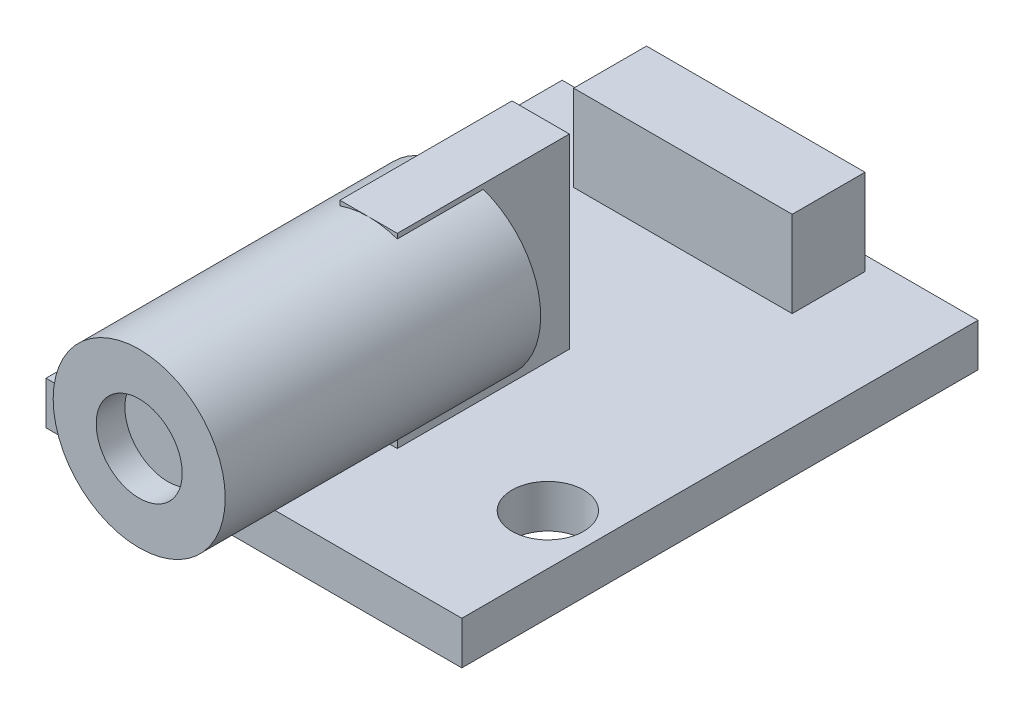
ISO-10303-21;
HEADER;
FILE_DESCRIPTION(('STEP AP214'),'2;1');
FILE_NAME('part.step','',(''),(''),'','','');
FILE_SCHEMA(('AUTOMOTIVE_DESIGN { 1 0 10303 214 1 1 1 1 }'));
ENDSEC;
DATA;
#1=APPLICATION_CONTEXT('core data for automotive mechanical design processes');
#2=APPLICATION_PROTOCOL_DEFINITION('international standard','automotive_design',2000,#1);
#3=PRODUCT_CONTEXT('',#1,'mechanical');
#4=PRODUCT('Part','Part','',(#3));
#5=PRODUCT_RELATED_PRODUCT_CATEGORY('part','',(#4));
#6=PRODUCT_DEFINITION_FORMATION('','',#4);
#7=PRODUCT_DEFINITION_CONTEXT('part definition',#1,'design');
#8=PRODUCT_DEFINITION('design','',#6,#7);
#9=PRODUCT_DEFINITION_SHAPE('','',#8);
#10=(LENGTH_UNIT() NAMED_UNIT(*) SI_UNIT(.MILLI.,.METRE.));
#11=(NAMED_UNIT(*) PLANE_ANGLE_UNIT() SI_UNIT($,.RADIAN.));
#12=(NAMED_UNIT(*) SI_UNIT($,.STERADIAN.) SOLID_ANGLE_UNIT());
#13=UNCERTAINTY_MEASURE_WITH_UNIT(LENGTH_MEASURE(1.E-05),#10,'distance_accuracy_value','');
#14=(GEOMETRIC_REPRESENTATION_CONTEXT(3) GLOBAL_UNCERTAINTY_ASSIGNED_CONTEXT((#13)) GLOBAL_UNIT_ASSIGNED_CONTEXT((#10,
#11,#12)) REPRESENTATION_CONTEXT('',''));
#15=CARTESIAN_POINT('',(0.,0.,0.));
#16=DIRECTION('',(0.,0.,1.));
#17=DIRECTION('',(1.,0.,0.));
#18=AXIS2_PLACEMENT_3D('',#15,#16,#17);
#19=CARTESIAN_POINT('',(0.,1.5,0.));
#20=DIRECTION('',(0.,1.,0.));
#21=DIRECTION('',(0.,0.,1.));
#22=AXIS2_PLACEMENT_3D('',#19,#20,#21);
#23=PLANE('',#22);
#24=CARTESIAN_POINT('',(-5.5,1.5,4.25));
#25=DIRECTION('',(0.,1.,0.));
#26=DIRECTION('',(0.,0.,1.));
#27=AXIS2_PLACEMENT_3D('',#24,#25,#26);
#28=CIRCLE('',#27,1.25);
#29=CARTESIAN_POINT('',(-5.5,1.5,5.5));
#30=VERTEX_POINT('',#29);
#31=EDGE_CURVE('E580',#30,#30,#28,.T.);
#32=ORIENTED_EDGE('',*,*,#31,.F.);
#33=EDGE_LOOP('',(#32));
#34=FACE_BOUND('',#33,.T.);
#35=CARTESIAN_POINT('',(5.5,1.5,4.25));
#36=DIRECTION('',(0.,1.,0.));
#37=DIRECTION('',(0.,0.,-1.));
#38=AXIS2_PLACEMENT_3D('',#35,#36,#37);
#39=CIRCLE('',#38,1.25);
#40=CARTESIAN_POINT('',(5.5,1.5,3.));
#41=VERTEX_POINT('',#40);
#42=EDGE_CURVE('E574',#41,#41,#39,.T.);
#43=ORIENTED_EDGE('',*,*,#42,.F.);
#44=EDGE_LOOP('',(#43));
#45=FACE_BOUND('',#44,.T.);
#46=DIRECTION('',(0.,0.,-1.));
#47=VECTOR('',#46,1.);
#48=CARTESIAN_POINT('',(7.25,1.5,-9.));
#49=LINE('',#48,#47);
#50=CARTESIAN_POINT('',(7.25,1.5,9.));
#51=VERTEX_POINT('',#50);
#52=CARTESIAN_POINT('',(7.25,1.5,-9.));
#53=VERTEX_POINT('',#52);
#54=EDGE_CURVE('E251',#51,#53,#49,.T.);
#55=ORIENTED_EDGE('',*,*,#54,.T.);
#56=DIRECTION('',(-1.,0.,0.));
#57=VECTOR('',#56,1.);
#58=CARTESIAN_POINT('',(-7.25,1.5,-9.));
#59=LINE('',#58,#57);
#60=CARTESIAN_POINT('',(-7.25,1.5,-9.));
#61=VERTEX_POINT('',#60);
#62=EDGE_CURVE('E254',#53,#61,#59,.T.);
#63=ORIENTED_EDGE('',*,*,#62,.T.);
#64=DIRECTION('',(0.,0.,1.));
#65=VECTOR('',#64,1.);
#66=CARTESIAN_POINT('',(-7.25,1.5,-9.));
#67=LINE('',#66,#65);
#68=CARTESIAN_POINT('',(-7.25,1.5,9.));
#69=VERTEX_POINT('',#68);
#70=EDGE_CURVE('E257',#61,#69,#67,.T.);
#71=ORIENTED_EDGE('',*,*,#70,.T.);
#72=DIRECTION('',(1.,0.,0.));
#73=VECTOR('',#72,1.);
#74=CARTESIAN_POINT('',(-7.25,1.5,9.));
#75=LINE('',#74,#73);
#76=EDGE_CURVE('E259',#69,#51,#75,.T.);
#77=ORIENTED_EDGE('',*,*,#76,.T.);
#78=EDGE_LOOP('',(#55,#63,#71,#77));
#79=FACE_BOUND('',#78,.T.);
#80=DIRECTION('',(-1.,0.,0.));
#81=VECTOR('',#80,1.);
#82=CARTESIAN_POINT('',(-1.,1.5,-1.));
#83=LINE('',#82,#81);
#84=CARTESIAN_POINT('',(1.,1.5,-1.));
#85=VERTEX_POINT('',#84);
#86=CARTESIAN_POINT('',(-1.,1.5,-1.));
#87=VERTEX_POINT('',#86);
#88=EDGE_CURVE('E231',#85,#87,#83,.T.);
#89=ORIENTED_EDGE('',*,*,#88,.F.);
#90=DIRECTION('',(0.,0.,-1.));
#91=VECTOR('',#90,1.);
#92=CARTESIAN_POINT('',(1.,1.5,-1.));
#93=LINE('',#92,#91);
#94=CARTESIAN_POINT('',(1.,1.5,5.));
#95=VERTEX_POINT('',#94);
#96=EDGE_CURVE('E215',#95,#85,#93,.T.);
#97=ORIENTED_EDGE('',*,*,#96,.F.);
#98=DIRECTION('',(1.,0.,0.));
#99=VECTOR('',#98,1.);
#100=CARTESIAN_POINT('',(-1.,1.5,5.));
#101=LINE('',#100,#99);
#102=CARTESIAN_POINT('',(-1.,1.5,5.));
#103=VERTEX_POINT('',#102);
#104=EDGE_CURVE('E220',#103,#95,#101,.T.);
#105=ORIENTED_EDGE('',*,*,#104,.F.);
#106=DIRECTION('',(0.,0.,1.));
#107=VECTOR('',#106,1.);
#108=CARTESIAN_POINT('',(-1.,1.5,-1.));
#109=LINE('',#108,#107);
#110=EDGE_CURVE('E233',#87,#103,#109,.T.);
#111=ORIENTED_EDGE('',*,*,#110,.F.);
#112=EDGE_LOOP('',(#89,#97,#105,#111));
#113=FACE_BOUND('',#112,.T.);
#114=DIRECTION('',(-1.,0.,0.));
#115=VECTOR('',#114,1.);
#116=CARTESIAN_POINT('',(-3.81,1.5,-8.5));
#117=LINE('',#116,#115);
#118=CARTESIAN_POINT('',(3.81,1.5,-8.5));
#119=VERTEX_POINT('',#118);
#120=CARTESIAN_POINT('',(-3.81,1.5,-8.5));
#121=VERTEX_POINT('',#120);
#122=EDGE_CURVE('E561',#119,#121,#117,.T.);
#123=ORIENTED_EDGE('',*,*,#122,.F.);
#124=DIRECTION('',(0.,0.,-1.));
#125=VECTOR('',#124,1.);
#126=CARTESIAN_POINT('',(3.81,1.5,-8.5));
#127=LINE('',#126,#125);
#128=CARTESIAN_POINT('',(3.81,1.5,-5.96));
#129=VERTEX_POINT('',#128);
#130=EDGE_CURVE('E177',#129,#119,#127,.T.);
#131=ORIENTED_EDGE('',*,*,#130,.F.);
#132=DIRECTION('',(1.,0.,0.));
#133=VECTOR('',#132,1.);
#134=CARTESIAN_POINT('',(-3.81,1.5,-5.96));
#135=LINE('',#134,#133);
#136=CARTESIAN_POINT('',(-3.81,1.5,-5.96));
#137=VERTEX_POINT('',#136);
#138=EDGE_CURVE('E173',#137,#129,#135,.T.);
#139=ORIENTED_EDGE('',*,*,#138,.F.);
#140=DIRECTION('',(0.,0.,1.));
#141=VECTOR('',#140,1.);
#142=CARTESIAN_POINT('',(-3.81,1.5,-8.5));
#143=LINE('',#142,#141);
#144=EDGE_CURVE('E563',#121,#137,#143,.T.);
#145=ORIENTED_EDGE('',*,*,#144,.F.);
#146=EDGE_LOOP('',(#123,#131,#139,#145));
#147=FACE_BOUND('',#146,.T.);
#148=ADVANCED_FACE('F37',(#34,#45,#79,#113,#147),#23,.T.);
#149=CARTESIAN_POINT('',(-1.,8.,5.));
#150=DIRECTION('',(0.,0.,-1.));
#151=DIRECTION('',(-1.,0.,0.));
#152=AXIS2_PLACEMENT_3D('',#149,#150,#151);
#153=PLANE('',#152);
#154=DIRECTION('',(0.,-1.,0.));
#155=VECTOR('',#154,1.);
#156=CARTESIAN_POINT('',(-1.,8.,5.));
#157=LINE('',#156,#155);
#158=CARTESIAN_POINT('',(-1.,8.,5.));
#159=VERTEX_POINT('',#158);
#160=CARTESIAN_POINT('',(-1.,7.82842712474619,5.));
#161=VERTEX_POINT('',#160);
#162=EDGE_CURVE('E242',#159,#161,#157,.T.);
#163=ORIENTED_EDGE('',*,*,#162,.T.);
#164=CARTESIAN_POINT('',(0.,5.,5.));
#165=DIRECTION('',(0.,0.,-1.));
#166=DIRECTION('',(-1.,0.,0.));
#167=AXIS2_PLACEMENT_3D('',#164,#165,#166);
#168=CIRCLE('',#167,3.);
#169=CARTESIAN_POINT('',(0.,8.,5.));
#170=VERTEX_POINT('',#169);
#171=EDGE_CURVE('E204',#161,#170,#168,.T.);
#172=ORIENTED_EDGE('',*,*,#171,.T.);
#173=DIRECTION('',(1.,0.,0.));
#174=VECTOR('',#173,1.);
#175=CARTESIAN_POINT('',(-1.,8.,5.));
#176=LINE('',#175,#174);
#177=EDGE_CURVE('E225',#159,#170,#176,.T.);
#178=ORIENTED_EDGE('',*,*,#177,.F.);
#179=EDGE_LOOP('',(#163,#172,#178));
#180=FACE_BOUND('',#179,.T.);
#181=ADVANCED_FACE('F303',(#180),#153,.F.);
#182=CARTESIAN_POINT('',(1.,8.,5.));
#183=VERTEX_POINT('',#182);
#184=EDGE_CURVE('E224',#170,#183,#176,.T.);
#185=ORIENTED_EDGE('',*,*,#184,.F.);
#186=CARTESIAN_POINT('',(1.,7.82842712474619,5.));
#187=VERTEX_POINT('',#186);
#188=EDGE_CURVE('E200',#170,#187,#168,.T.);
#189=ORIENTED_EDGE('',*,*,#188,.T.);
#190=DIRECTION('',(0.,-1.,0.));
#191=VECTOR('',#190,1.);
#192=CARTESIAN_POINT('',(1.,8.,5.));
#193=LINE('',#192,#191);
#194=EDGE_CURVE('E238',#183,#187,#193,.T.);
#195=ORIENTED_EDGE('',*,*,#194,.F.);
#196=EDGE_LOOP('',(#185,#189,#195));
#197=FACE_BOUND('',#196,.T.);
#198=ADVANCED_FACE('F301',(#197),#153,.F.);
#199=CARTESIAN_POINT('',(7.25,1.5,-9.));
#200=DIRECTION('',(-1.,0.,0.));
#201=DIRECTION('',(0.,0.,1.));
#202=AXIS2_PLACEMENT_3D('',#199,#200,#201);
#203=PLANE('',#202);
#204=DIRECTION('',(0.,0.,-1.));
#205=VECTOR('',#204,1.);
#206=CARTESIAN_POINT('',(7.25,0.,-9.));
#207=LINE('',#206,#205);
#208=CARTESIAN_POINT('',(7.25,0.,9.));
#209=VERTEX_POINT('',#208);
#210=CARTESIAN_POINT('',(7.25,0.,-9.));
#211=VERTEX_POINT('',#210);
#212=EDGE_CURVE('E250',#209,#211,#207,.T.);
#213=ORIENTED_EDGE('',*,*,#212,.T.);
#214=DIRECTION('',(0.,-1.,0.));
#215=VECTOR('',#214,1.);
#216=CARTESIAN_POINT('',(7.25,1.5,-9.));
#217=LINE('',#216,#215);
#218=EDGE_CURVE('E11',#53,#211,#217,.T.);
#219=ORIENTED_EDGE('',*,*,#218,.F.);
#220=ORIENTED_EDGE('',*,*,#54,.F.);
#221=DIRECTION('',(0.,-1.,0.));
#222=VECTOR('',#221,1.);
#223=CARTESIAN_POINT('',(7.25,1.5,9.));
#224=LINE('',#223,#222);
#225=EDGE_CURVE('E261',#51,#209,#224,.T.);
#226=ORIENTED_EDGE('',*,*,#225,.T.);
#227=EDGE_LOOP('',(#213,#219,#220,#226));
#228=FACE_BOUND('',#227,.T.);
#229=ADVANCED_FACE('F39',(#228),#203,.F.);
#230=CARTESIAN_POINT('',(-7.25,1.5,-9.));
#231=DIRECTION('',(0.,0.,1.));
#232=DIRECTION('',(1.,0.,0.));
#233=AXIS2_PLACEMENT_3D('',#230,#231,#232);
#234=PLANE('',#233);
#235=DIRECTION('',(-1.,0.,0.));
#236=VECTOR('',#235,1.);
#237=CARTESIAN_POINT('',(-7.25,0.,-9.));
#238=LINE('',#237,#236);
#239=CARTESIAN_POINT('',(-7.25,0.,-9.));
#240=VERTEX_POINT('',#239);
#241=EDGE_CURVE('E264',#211,#240,#238,.T.);
#242=ORIENTED_EDGE('',*,*,#241,.T.);
#243=DIRECTION('',(0.,-1.,0.));
#244=VECTOR('',#243,1.);
#245=CARTESIAN_POINT('',(-7.25,1.5,-9.));
#246=LINE('',#245,#244);
#247=EDGE_CURVE('E45',#61,#240,#246,.T.);
#248=ORIENTED_EDGE('',*,*,#247,.F.);
#249=ORIENTED_EDGE('',*,*,#62,.F.);
#250=ORIENTED_EDGE('',*,*,#218,.T.);
#251=EDGE_LOOP('',(#242,#248,#249,#250));
#252=FACE_BOUND('',#251,.T.);
#253=ADVANCED_FACE('F294',(#252),#234,.F.);
#254=CARTESIAN_POINT('',(-7.25,1.5,-9.));
#255=DIRECTION('',(1.,0.,0.));
#256=DIRECTION('',(0.,0.,-1.));
#257=AXIS2_PLACEMENT_3D('',#254,#255,#256);
#258=PLANE('',#257);
#259=DIRECTION('',(0.,0.,1.));
#260=VECTOR('',#259,1.);
#261=CARTESIAN_POINT('',(-7.25,0.,-9.));
#262=LINE('',#261,#260);
#263=CARTESIAN_POINT('',(-7.25,0.,9.));
#264=VERTEX_POINT('',#263);
#265=EDGE_CURVE('E266',#240,#264,#262,.T.);
#266=ORIENTED_EDGE('',*,*,#265,.T.);
#267=DIRECTION('',(0.,-1.,0.));
#268=VECTOR('',#267,1.);
#269=CARTESIAN_POINT('',(-7.25,1.5,9.));
#270=LINE('',#269,#268);
#271=EDGE_CURVE('E271',#69,#264,#270,.T.);
#272=ORIENTED_EDGE('',*,*,#271,.F.);
#273=ORIENTED_EDGE('',*,*,#70,.F.);
#274=ORIENTED_EDGE('',*,*,#247,.T.);
#275=EDGE_LOOP('',(#266,#272,#273,#274));
#276=FACE_BOUND('',#275,.T.);
#277=ADVANCED_FACE('F278',(#276),#258,.F.);
#278=CARTESIAN_POINT('',(-7.25,1.5,9.));
#279=DIRECTION('',(0.,0.,-1.));
#280=DIRECTION('',(-1.,0.,0.));
#281=AXIS2_PLACEMENT_3D('',#278,#279,#280);
#282=PLANE('',#281);
#283=DIRECTION('',(1.,0.,0.));
#284=VECTOR('',#283,1.);
#285=CARTESIAN_POINT('',(-7.25,0.,9.));
#286=LINE('',#285,#284);
#287=EDGE_CURVE('E255',#264,#209,#286,.T.);
#288=ORIENTED_EDGE('',*,*,#287,.T.);
#289=ORIENTED_EDGE('',*,*,#225,.F.);
#290=ORIENTED_EDGE('',*,*,#76,.F.);
#291=ORIENTED_EDGE('',*,*,#271,.T.);
#292=EDGE_LOOP('',(#288,#289,#290,#291));
#293=FACE_BOUND('',#292,.T.);
#294=ADVANCED_FACE('F287',(#293),#282,.F.);
#295=CARTESIAN_POINT('',(0.,0.,0.));
#296=DIRECTION('',(0.,1.,0.));
#297=DIRECTION('',(0.,0.,1.));
#298=AXIS2_PLACEMENT_3D('',#295,#296,#297);
#299=PLANE('',#298);
#300=CARTESIAN_POINT('',(-5.5,0.,4.25));
#301=DIRECTION('',(0.,1.,0.));
#302=DIRECTION('',(0.,0.,1.));
#303=AXIS2_PLACEMENT_3D('',#300,#301,#302);
#304=CIRCLE('',#303,1.25);
#305=CARTESIAN_POINT('',(-5.5,0.,5.5));
#306=VERTEX_POINT('',#305);
#307=EDGE_CURVE('E566',#306,#306,#304,.T.);
#308=ORIENTED_EDGE('',*,*,#307,.T.);
#309=EDGE_LOOP('',(#308));
#310=FACE_BOUND('',#309,.T.);
#311=CARTESIAN_POINT('',(5.5,0.,4.25));
#312=DIRECTION('',(0.,1.,0.));
#313=DIRECTION('',(0.,0.,-1.));
#314=AXIS2_PLACEMENT_3D('',#311,#312,#313);
#315=CIRCLE('',#314,1.25);
#316=CARTESIAN_POINT('',(5.5,0.,3.));
#317=VERTEX_POINT('',#316);
#318=EDGE_CURVE('E577',#317,#317,#315,.T.);
#319=ORIENTED_EDGE('',*,*,#318,.T.);
#320=EDGE_LOOP('',(#319));
#321=FACE_BOUND('',#320,.T.);
#322=ORIENTED_EDGE('',*,*,#212,.F.);
#323=ORIENTED_EDGE('',*,*,#287,.F.);
#324=ORIENTED_EDGE('',*,*,#265,.F.);
#325=ORIENTED_EDGE('',*,*,#241,.F.);
#326=EDGE_LOOP('',(#322,#323,#324,#325));
#327=FACE_BOUND('',#326,.T.);
#328=ADVANCED_FACE('F284',(#310,#321,#327),#299,.F.);
#329=CARTESIAN_POINT('',(1.,8.,-1.));
#330=DIRECTION('',(-1.,0.,0.));
#331=DIRECTION('',(0.,0.,1.));
#332=AXIS2_PLACEMENT_3D('',#329,#330,#331);
#333=PLANE('',#332);
#334=DIRECTION('',(0.,1.,0.));
#335=VECTOR('',#334,1.);
#336=CARTESIAN_POINT('',(1.,8.,2.));
#337=LINE('',#336,#335);
#338=CARTESIAN_POINT('',(1.,2.17157287525381,2.));
#339=VERTEX_POINT('',#338);
#340=CARTESIAN_POINT('',(1.,7.82842712474619,2.));
#341=VERTEX_POINT('',#340);
#342=EDGE_CURVE('E198',#339,#341,#337,.T.);
#343=ORIENTED_EDGE('',*,*,#342,.F.);
#344=DIRECTION('',(0.,0.,1.));
#345=VECTOR('',#344,1.);
#346=CARTESIAN_POINT('',(1.,2.17157287525381,2.));
#347=LINE('',#346,#345);
#348=CARTESIAN_POINT('',(1.,2.17157287525381,5.));
#349=VERTEX_POINT('',#348);
#350=EDGE_CURVE('E209',#339,#349,#347,.T.);
#351=ORIENTED_EDGE('',*,*,#350,.T.);
#352=EDGE_CURVE('E228',#349,#95,#193,.T.);
#353=ORIENTED_EDGE('',*,*,#352,.T.);
#354=ORIENTED_EDGE('',*,*,#96,.T.);
#355=DIRECTION('',(0.,-1.,0.));
#356=VECTOR('',#355,1.);
#357=CARTESIAN_POINT('',(1.,8.,-1.));
#358=LINE('',#357,#356);
#359=CARTESIAN_POINT('',(1.,8.,-1.));
#360=VERTEX_POINT('',#359);
#361=EDGE_CURVE('E248',#360,#85,#358,.T.);
#362=ORIENTED_EDGE('',*,*,#361,.F.);
#363=DIRECTION('',(0.,0.,-1.));
#364=VECTOR('',#363,1.);
#365=CARTESIAN_POINT('',(1.,8.,-1.));
#366=LINE('',#365,#364);
#367=EDGE_CURVE('E216',#183,#360,#366,.T.);
#368=ORIENTED_EDGE('',*,*,#367,.F.);
#369=ORIENTED_EDGE('',*,*,#194,.T.);
#370=DIRECTION('',(0.,0.,1.));
#371=VECTOR('',#370,1.);
#372=CARTESIAN_POINT('',(1.,7.82842712474619,2.));
#373=LINE('',#372,#371);
#374=EDGE_CURVE('E203',#187,#341,#373,.F.);
#375=ORIENTED_EDGE('',*,*,#374,.T.);
#376=EDGE_LOOP('',(#343,#351,#353,#354,#362,#368,#369,#375));
#377=FACE_BOUND('',#376,.T.);
#378=ADVANCED_FACE('F316',(#377),#333,.F.);
#379=CARTESIAN_POINT('',(-1.,8.,-1.));
#380=DIRECTION('',(0.,0.,1.));
#381=DIRECTION('',(1.,0.,0.));
#382=AXIS2_PLACEMENT_3D('',#379,#380,#381);
#383=PLANE('',#382);
#384=ORIENTED_EDGE('',*,*,#88,.T.);
#385=DIRECTION('',(0.,-1.,0.));
#386=VECTOR('',#385,1.);
#387=CARTESIAN_POINT('',(-1.,8.,-1.));
#388=LINE('',#387,#386);
#389=CARTESIAN_POINT('',(-1.,8.,-1.));
#390=VERTEX_POINT('',#389);
#391=EDGE_CURVE('E245',#390,#87,#388,.T.);
#392=ORIENTED_EDGE('',*,*,#391,.F.);
#393=DIRECTION('',(-1.,0.,0.));
#394=VECTOR('',#393,1.);
#395=CARTESIAN_POINT('',(-1.,8.,-1.));
#396=LINE('',#395,#394);
#397=EDGE_CURVE('E219',#360,#390,#396,.T.);
#398=ORIENTED_EDGE('',*,*,#397,.F.);
#399=ORIENTED_EDGE('',*,*,#361,.T.);
#400=EDGE_LOOP('',(#384,#392,#398,#399));
#401=FACE_BOUND('',#400,.T.);
#402=ADVANCED_FACE('F338',(#401),#383,.F.);
#403=CARTESIAN_POINT('',(-1.,8.,-1.));
#404=DIRECTION('',(1.,0.,0.));
#405=DIRECTION('',(0.,0.,-1.));
#406=AXIS2_PLACEMENT_3D('',#403,#404,#405);
#407=PLANE('',#406);
#408=DIRECTION('',(0.,-1.,0.));
#409=VECTOR('',#408,1.);
#410=CARTESIAN_POINT('',(-1.,8.,2.));
#411=LINE('',#410,#409);
#412=CARTESIAN_POINT('',(-1.,7.82842712474619,2.));
#413=VERTEX_POINT('',#412);
#414=CARTESIAN_POINT('',(-1.,2.17157287525381,2.));
#415=VERTEX_POINT('',#414);
#416=EDGE_CURVE('E196',#413,#415,#411,.T.);
#417=ORIENTED_EDGE('',*,*,#416,.F.);
#418=DIRECTION('',(0.,0.,1.));
#419=VECTOR('',#418,1.);
#420=CARTESIAN_POINT('',(-1.,7.82842712474619,2.));
#421=LINE('',#420,#419);
#422=EDGE_CURVE('E212',#413,#161,#421,.T.);
#423=ORIENTED_EDGE('',*,*,#422,.T.);
#424=ORIENTED_EDGE('',*,*,#162,.F.);
#425=DIRECTION('',(0.,0.,1.));
#426=VECTOR('',#425,1.);
#427=CARTESIAN_POINT('',(-1.,8.,-1.));
#428=LINE('',#427,#426);
#429=EDGE_CURVE('E222',#390,#159,#428,.T.);
#430=ORIENTED_EDGE('',*,*,#429,.F.);
#431=ORIENTED_EDGE('',*,*,#391,.T.);
#432=ORIENTED_EDGE('',*,*,#110,.T.);
#433=CARTESIAN_POINT('',(-1.,2.17157287525381,5.));
#434=VERTEX_POINT('',#433);
#435=EDGE_CURVE('E241',#434,#103,#157,.T.);
#436=ORIENTED_EDGE('',*,*,#435,.F.);
#437=DIRECTION('',(0.,0.,1.));
#438=VECTOR('',#437,1.);
#439=CARTESIAN_POINT('',(-1.,2.17157287525381,2.));
#440=LINE('',#439,#438);
#441=EDGE_CURVE('E60',#434,#415,#440,.F.);
#442=ORIENTED_EDGE('',*,*,#441,.T.);
#443=EDGE_LOOP('',(#417,#423,#424,#430,#431,#432,#436,#442));
#444=FACE_BOUND('',#443,.T.);
#445=ADVANCED_FACE('F346',(#444),#407,.F.);
#446=ORIENTED_EDGE('',*,*,#352,.F.);
#447=EDGE_CURVE('E205',#349,#434,#168,.T.);
#448=ORIENTED_EDGE('',*,*,#447,.T.);
#449=ORIENTED_EDGE('',*,*,#435,.T.);
#450=ORIENTED_EDGE('',*,*,#104,.T.);
#451=EDGE_LOOP('',(#446,#448,#449,#450));
#452=FACE_BOUND('',#451,.T.);
#453=ADVANCED_FACE('F311',(#452),#153,.F.);
#454=CARTESIAN_POINT('',(0.,8.,0.));
#455=DIRECTION('',(0.,1.,0.));
#456=DIRECTION('',(0.,0.,1.));
#457=AXIS2_PLACEMENT_3D('',#454,#455,#456);
#458=PLANE('',#457);
#459=ORIENTED_EDGE('',*,*,#177,.T.);
#460=ORIENTED_EDGE('',*,*,#184,.T.);
#461=ORIENTED_EDGE('',*,*,#367,.T.);
#462=ORIENTED_EDGE('',*,*,#397,.T.);
#463=ORIENTED_EDGE('',*,*,#429,.T.);
#464=EDGE_LOOP('',(#459,#460,#461,#462,#463));
#465=FACE_BOUND('',#464,.T.);
#466=ADVANCED_FACE('F360',(#465),#458,.T.);
#467=CARTESIAN_POINT('',(0.,5.,2.));
#468=DIRECTION('',(0.,0.,1.));
#469=DIRECTION('',(1.,0.,0.));
#470=AXIS2_PLACEMENT_3D('',#467,#468,#469);
#471=CYLINDRICAL_SURFACE('',#470,3.);
#472=CARTESIAN_POINT('',(0.,5.,13.));
#473=DIRECTION('',(0.,0.,1.));
#474=DIRECTION('',(1.,0.,0.));
#475=AXIS2_PLACEMENT_3D('',#472,#473,#474);
#476=CIRCLE('',#475,3.);
#477=CARTESIAN_POINT('',(3.,5.,13.));
#478=VERTEX_POINT('',#477);
#479=EDGE_CURVE('E188',#478,#478,#476,.T.);
#480=ORIENTED_EDGE('',*,*,#479,.F.);
#481=EDGE_LOOP('',(#480));
#482=FACE_BOUND('',#481,.T.);
#483=ORIENTED_EDGE('',*,*,#422,.F.);
#484=CARTESIAN_POINT('',(0.,5.,2.));
#485=DIRECTION('',(0.,0.,1.));
#486=DIRECTION('',(1.,0.,0.));
#487=AXIS2_PLACEMENT_3D('',#484,#485,#486);
#488=CIRCLE('',#487,3.);
#489=EDGE_CURVE('E195',#413,#415,#488,.T.);
#490=ORIENTED_EDGE('',*,*,#489,.T.);
#491=ORIENTED_EDGE('',*,*,#441,.F.);
#492=ORIENTED_EDGE('',*,*,#447,.F.);
#493=ORIENTED_EDGE('',*,*,#350,.F.);
#494=EDGE_CURVE('E192',#339,#341,#488,.T.);
#495=ORIENTED_EDGE('',*,*,#494,.T.);
#496=ORIENTED_EDGE('',*,*,#374,.F.);
#497=ORIENTED_EDGE('',*,*,#188,.F.);
#498=ORIENTED_EDGE('',*,*,#171,.F.);
#499=EDGE_LOOP('',(#483,#490,#491,#492,#493,#495,#496,#497,#498));
#500=FACE_BOUND('',#499,.T.);
#501=ADVANCED_FACE('F367',(#482,#500),#471,.T.);
#502=CARTESIAN_POINT('',(0.,5.,2.));
#503=DIRECTION('',(0.,0.,1.));
#504=DIRECTION('',(1.,0.,0.));
#505=AXIS2_PLACEMENT_3D('',#502,#503,#504);
#506=PLANE('',#505);
#507=ORIENTED_EDGE('',*,*,#494,.F.);
#508=ORIENTED_EDGE('',*,*,#342,.T.);
#509=EDGE_LOOP('',(#507,#508));
#510=FACE_BOUND('',#509,.T.);
#511=ADVANCED_FACE('F375',(#510),#506,.F.);
#512=ORIENTED_EDGE('',*,*,#489,.F.);
#513=ORIENTED_EDGE('',*,*,#416,.T.);
#514=EDGE_LOOP('',(#512,#513));
#515=FACE_BOUND('',#514,.T.);
#516=ADVANCED_FACE('F383',(#515),#506,.F.);
#517=CARTESIAN_POINT('',(0.,5.,13.));
#518=DIRECTION('',(0.,0.,1.));
#519=DIRECTION('',(1.,0.,0.));
#520=AXIS2_PLACEMENT_3D('',#517,#518,#519);
#521=PLANE('',#520);
#522=CARTESIAN_POINT('',(0.,5.,13.));
#523=DIRECTION('',(0.,0.,1.));
#524=DIRECTION('',(1.,0.,0.));
#525=AXIS2_PLACEMENT_3D('',#522,#523,#524);
#526=CIRCLE('',#525,1.5);
#527=CARTESIAN_POINT('',(1.5,5.,13.));
#528=VERTEX_POINT('',#527);
#529=EDGE_CURVE('E179',#528,#528,#526,.T.);
#530=ORIENTED_EDGE('',*,*,#529,.F.);
#531=EDGE_LOOP('',(#530));
#532=FACE_BOUND('',#531,.T.);
#533=ORIENTED_EDGE('',*,*,#479,.T.);
#534=EDGE_LOOP('',(#533));
#535=FACE_BOUND('',#534,.T.);
#536=ADVANCED_FACE('F391',(#532,#535),#521,.T.);
#537=CARTESIAN_POINT('',(0.,5.,12.));
#538=DIRECTION('',(0.,0.,1.));
#539=DIRECTION('',(1.,0.,0.));
#540=AXIS2_PLACEMENT_3D('',#537,#538,#539);
#541=CYLINDRICAL_SURFACE('',#540,1.5);
#542=CARTESIAN_POINT('',(0.,5.,12.));
#543=DIRECTION('',(0.,0.,1.));
#544=DIRECTION('',(1.,0.,0.));
#545=AXIS2_PLACEMENT_3D('',#542,#543,#544);
#546=CIRCLE('',#545,1.5);
#547=CARTESIAN_POINT('',(1.5,5.,12.));
#548=VERTEX_POINT('',#547);
#549=EDGE_CURVE('E182',#548,#548,#546,.T.);
#550=ORIENTED_EDGE('',*,*,#549,.F.);
#551=EDGE_LOOP('',(#550));
#552=FACE_BOUND('',#551,.T.);
#553=ORIENTED_EDGE('',*,*,#529,.T.);
#554=EDGE_LOOP('',(#553));
#555=FACE_BOUND('',#554,.T.);
#556=ADVANCED_FACE('F398',(#552,#555),#541,.F.);
#557=CARTESIAN_POINT('',(0.,5.,12.));
#558=DIRECTION('',(0.,0.,1.));
#559=DIRECTION('',(1.,0.,0.));
#560=AXIS2_PLACEMENT_3D('',#557,#558,#559);
#561=PLANE('',#560);
#562=ORIENTED_EDGE('',*,*,#549,.T.);
#563=EDGE_LOOP('',(#562));
#564=FACE_BOUND('',#563,.T.);
#565=ADVANCED_FACE('F407',(#564),#561,.T.);
#566=CARTESIAN_POINT('',(3.81,4.5,-8.5));
#567=DIRECTION('',(-1.,0.,0.));
#568=DIRECTION('',(0.,0.,1.));
#569=AXIS2_PLACEMENT_3D('',#566,#567,#568);
#570=PLANE('',#569);
#571=ORIENTED_EDGE('',*,*,#130,.T.);
#572=DIRECTION('',(0.,-1.,0.));
#573=VECTOR('',#572,1.);
#574=CARTESIAN_POINT('',(3.81,4.5,-8.5));
#575=LINE('',#574,#573);
#576=CARTESIAN_POINT('',(3.81,4.5,-8.5));
#577=VERTEX_POINT('',#576);
#578=EDGE_CURVE('E158',#577,#119,#575,.T.);
#579=ORIENTED_EDGE('',*,*,#578,.F.);
#580=DIRECTION('',(0.,0.,-1.));
#581=VECTOR('',#580,1.);
#582=CARTESIAN_POINT('',(3.81,4.5,-8.5));
#583=LINE('',#582,#581);
#584=CARTESIAN_POINT('',(3.81,4.5,-5.96));
#585=VERTEX_POINT('',#584);
#586=EDGE_CURVE('E165',#585,#577,#583,.T.);
#587=ORIENTED_EDGE('',*,*,#586,.F.);
#588=DIRECTION('',(0.,-1.,0.));
#589=VECTOR('',#588,1.);
#590=CARTESIAN_POINT('',(3.81,4.5,-5.96));
#591=LINE('',#590,#589);
#592=EDGE_CURVE('E571',#585,#129,#591,.T.);
#593=ORIENTED_EDGE('',*,*,#592,.T.);
#594=EDGE_LOOP('',(#571,#579,#587,#593));
#595=FACE_BOUND('',#594,.T.);
#596=ADVANCED_FACE('F175',(#595),#570,.F.);
#597=CARTESIAN_POINT('',(-3.81,4.5,-8.5));
#598=DIRECTION('',(0.,0.,1.));
#599=DIRECTION('',(1.,0.,0.));
#600=AXIS2_PLACEMENT_3D('',#597,#598,#599);
#601=PLANE('',#600);
#602=ORIENTED_EDGE('',*,*,#122,.T.);
#603=DIRECTION('',(0.,-1.,0.));
#604=VECTOR('',#603,1.);
#605=CARTESIAN_POINT('',(-3.81,4.5,-8.5));
#606=LINE('',#605,#604);
#607=CARTESIAN_POINT('',(-3.81,4.5,-8.5));
#608=VERTEX_POINT('',#607);
#609=EDGE_CURVE('E161',#608,#121,#606,.T.);
#610=ORIENTED_EDGE('',*,*,#609,.F.);
#611=DIRECTION('',(-1.,0.,0.));
#612=VECTOR('',#611,1.);
#613=CARTESIAN_POINT('',(-3.81,4.5,-8.5));
#614=LINE('',#613,#612);
#615=EDGE_CURVE('E154',#577,#608,#614,.T.);
#616=ORIENTED_EDGE('',*,*,#615,.F.);
#617=ORIENTED_EDGE('',*,*,#578,.T.);
#618=EDGE_LOOP('',(#602,#610,#616,#617));
#619=FACE_BOUND('',#618,.T.);
#620=ADVANCED_FACE('F156',(#619),#601,.F.);
#621=CARTESIAN_POINT('',(-3.81,4.5,-8.5));
#622=DIRECTION('',(1.,0.,0.));
#623=DIRECTION('',(0.,0.,-1.));
#624=AXIS2_PLACEMENT_3D('',#621,#622,#623);
#625=PLANE('',#624);
#626=ORIENTED_EDGE('',*,*,#144,.T.);
#627=DIRECTION('',(0.,-1.,0.));
#628=VECTOR('',#627,1.);
#629=CARTESIAN_POINT('',(-3.81,4.5,-5.96));
#630=LINE('',#629,#628);
#631=CARTESIAN_POINT('',(-3.81,4.5,-5.96));
#632=VERTEX_POINT('',#631);
#633=EDGE_CURVE('E52',#632,#137,#630,.T.);
#634=ORIENTED_EDGE('',*,*,#633,.F.);
#635=DIRECTION('',(0.,0.,1.));
#636=VECTOR('',#635,1.);
#637=CARTESIAN_POINT('',(-3.81,4.5,-8.5));
#638=LINE('',#637,#636);
#639=EDGE_CURVE('E164',#608,#632,#638,.T.);
#640=ORIENTED_EDGE('',*,*,#639,.F.);
#641=ORIENTED_EDGE('',*,*,#609,.T.);
#642=EDGE_LOOP('',(#626,#634,#640,#641));
#643=FACE_BOUND('',#642,.T.);
#644=ADVANCED_FACE('F428',(#643),#625,.F.);
#645=CARTESIAN_POINT('',(-3.81,4.5,-5.96));
#646=DIRECTION('',(0.,0.,-1.));
#647=DIRECTION('',(-1.,0.,0.));
#648=AXIS2_PLACEMENT_3D('',#645,#646,#647);
#649=PLANE('',#648);
#650=ORIENTED_EDGE('',*,*,#138,.T.);
#651=ORIENTED_EDGE('',*,*,#592,.F.);
#652=DIRECTION('',(1.,0.,0.));
#653=VECTOR('',#652,1.);
#654=CARTESIAN_POINT('',(-3.81,4.5,-5.96));
#655=LINE('',#654,#653);
#656=EDGE_CURVE('E169',#632,#585,#655,.T.);
#657=ORIENTED_EDGE('',*,*,#656,.F.);
#658=ORIENTED_EDGE('',*,*,#633,.T.);
#659=EDGE_LOOP('',(#650,#651,#657,#658));
#660=FACE_BOUND('',#659,.T.);
#661=ADVANCED_FACE('F435',(#660),#649,.F.);
#662=CARTESIAN_POINT('',(0.,4.5,0.));
#663=DIRECTION('',(0.,1.,0.));
#664=DIRECTION('',(0.,0.,1.));
#665=AXIS2_PLACEMENT_3D('',#662,#663,#664);
#666=PLANE('',#665);
#667=ORIENTED_EDGE('',*,*,#586,.T.);
#668=ORIENTED_EDGE('',*,*,#615,.T.);
#669=ORIENTED_EDGE('',*,*,#639,.T.);
#670=ORIENTED_EDGE('',*,*,#656,.T.);
#671=EDGE_LOOP('',(#667,#668,#669,#670));
#672=FACE_BOUND('',#671,.T.);
#673=ADVANCED_FACE('F168',(#672),#666,.T.);
#674=CARTESIAN_POINT('',(5.5,0.,4.25));
#675=DIRECTION('',(0.,1.,0.));
#676=DIRECTION('',(0.,0.,1.));
#677=AXIS2_PLACEMENT_3D('',#674,#675,#676);
#678=CYLINDRICAL_SURFACE('',#677,1.25);
#679=ORIENTED_EDGE('',*,*,#318,.F.);
#680=EDGE_LOOP('',(#679));
#681=FACE_BOUND('',#680,.T.);
#682=ORIENTED_EDGE('',*,*,#42,.T.);
#683=EDGE_LOOP('',(#682));
#684=FACE_BOUND('',#683,.T.);
#685=ADVANCED_FACE('F449',(#681,#684),#678,.F.);
#686=CARTESIAN_POINT('',(-5.5,0.,4.25));
#687=DIRECTION('',(0.,1.,0.));
#688=DIRECTION('',(0.,0.,1.));
#689=AXIS2_PLACEMENT_3D('',#686,#687,#688);
#690=CYLINDRICAL_SURFACE('',#689,1.25);
#691=ORIENTED_EDGE('',*,*,#307,.F.);
#692=EDGE_LOOP('',(#691));
#693=FACE_BOUND('',#692,.T.);
#694=ORIENTED_EDGE('',*,*,#31,.T.);
#695=EDGE_LOOP('',(#694));
#696=FACE_BOUND('',#695,.T.);
#697=ADVANCED_FACE('F455',(#693,#696),#690,.F.);
#698=CLOSED_SHELL('',(#148,#181,#198,#229,#253,#277,#294,#328,#378,#402,#445,#453,#466,#501,
#511,#516,#536,#556,#565,#596,#620,#644,#661,#673,#685,#697));
#699=MANIFOLD_SOLID_BREP('B2',#698);
#700=ADVANCED_BREP_SHAPE_REPRESENTATION('',(#18,#699),#14);
#701=SHAPE_DEFINITION_REPRESENTATION(#9,#700);
ENDSEC;
END-ISO-10303-21;
